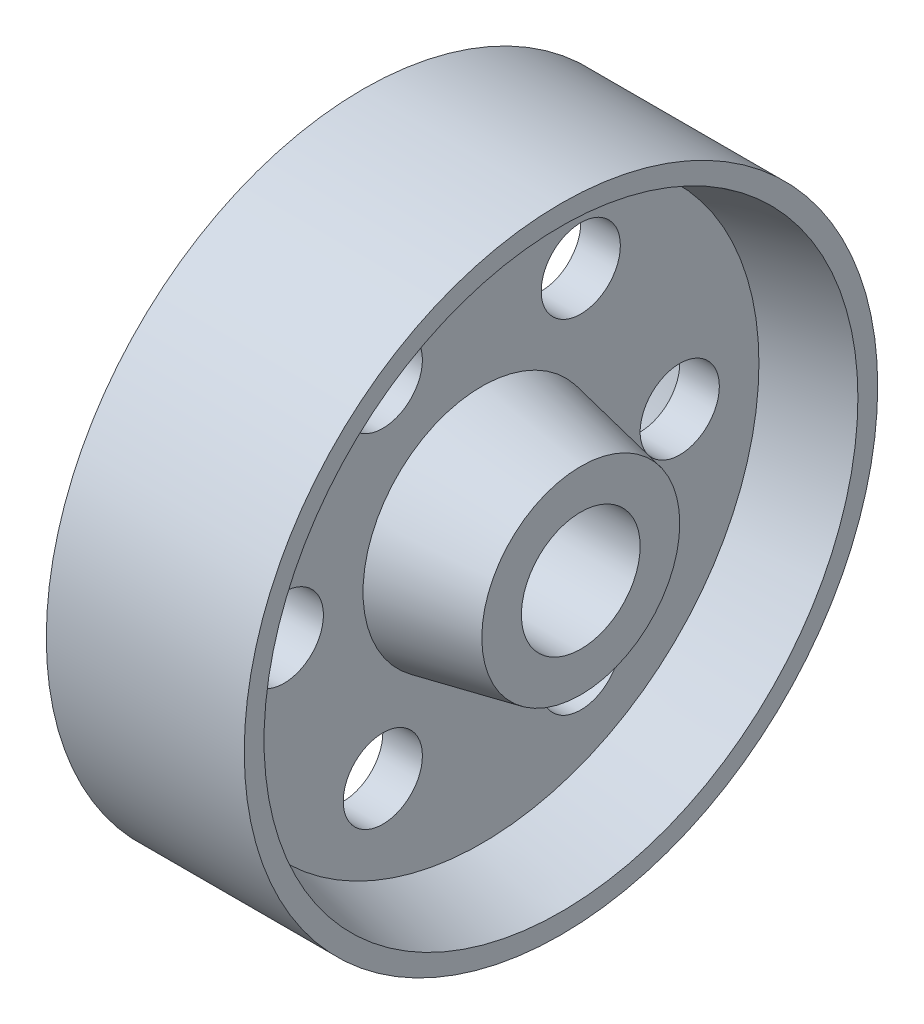
ISO-10303-21;
HEADER;
FILE_DESCRIPTION(('STEP AP214'),'2;1');
FILE_NAME('part.step','',(''),(''),'','','');
FILE_SCHEMA(('AUTOMOTIVE_DESIGN { 1 0 10303 214 1 1 1 1 }'));
ENDSEC;
DATA;
#1=APPLICATION_CONTEXT('core data for automotive mechanical design processes');
#2=APPLICATION_PROTOCOL_DEFINITION('international standard','automotive_design',2000,#1);
#3=PRODUCT_CONTEXT('',#1,'mechanical');
#4=PRODUCT('Part','Part','',(#3));
#5=PRODUCT_RELATED_PRODUCT_CATEGORY('part','',(#4));
#6=PRODUCT_DEFINITION_FORMATION('','',#4);
#7=PRODUCT_DEFINITION_CONTEXT('part definition',#1,'design');
#8=PRODUCT_DEFINITION('design','',#6,#7);
#9=PRODUCT_DEFINITION_SHAPE('','',#8);
#10=(LENGTH_UNIT() NAMED_UNIT(*) SI_UNIT(.MILLI.,.METRE.));
#11=(NAMED_UNIT(*) PLANE_ANGLE_UNIT() SI_UNIT($,.RADIAN.));
#12=(NAMED_UNIT(*) SI_UNIT($,.STERADIAN.) SOLID_ANGLE_UNIT());
#13=UNCERTAINTY_MEASURE_WITH_UNIT(LENGTH_MEASURE(1.E-05),#10,'distance_accuracy_value','');
#14=(GEOMETRIC_REPRESENTATION_CONTEXT(3) GLOBAL_UNCERTAINTY_ASSIGNED_CONTEXT((#13)) GLOBAL_UNIT_ASSIGNED_CONTEXT((#10,
#11,#12)) REPRESENTATION_CONTEXT('',''));
#15=CARTESIAN_POINT('',(0.,0.,0.));
#16=DIRECTION('',(0.,0.,1.));
#17=DIRECTION('',(1.,0.,0.));
#18=AXIS2_PLACEMENT_3D('',#15,#16,#17);
#19=CARTESIAN_POINT('',(0.,0.,0.));
#20=DIRECTION('',(1.,0.,0.));
#21=DIRECTION('',(0.,0.,-1.));
#22=AXIS2_PLACEMENT_3D('',#19,#20,#21);
#23=CYLINDRICAL_SURFACE('',#22,50.8);
#24=CARTESIAN_POINT('',(-15.875,0.,0.));
#25=DIRECTION('',(1.,0.,0.));
#26=DIRECTION('',(0.,0.,-1.));
#27=AXIS2_PLACEMENT_3D('',#24,#25,#26);
#28=CIRCLE('',#27,50.8);
#29=CARTESIAN_POINT('',(-15.875,0.,-50.8));
#30=VERTEX_POINT('',#29);
#31=EDGE_CURVE('E84',#30,#30,#28,.T.);
#32=ORIENTED_EDGE('',*,*,#31,.T.);
#33=EDGE_LOOP('',(#32));
#34=FACE_BOUND('',#33,.T.);
#35=CARTESIAN_POINT('',(15.875,0.,0.));
#36=DIRECTION('',(1.,0.,0.));
#37=DIRECTION('',(0.,0.,-1.));
#38=AXIS2_PLACEMENT_3D('',#35,#36,#37);
#39=CIRCLE('',#38,50.8);
#40=CARTESIAN_POINT('',(15.875,0.,-50.8));
#41=VERTEX_POINT('',#40);
#42=EDGE_CURVE('E131',#41,#41,#39,.T.);
#43=ORIENTED_EDGE('',*,*,#42,.F.);
#44=EDGE_LOOP('',(#43));
#45=FACE_BOUND('',#44,.T.);
#46=ADVANCED_FACE('F43',(#34,#45),#23,.T.);
#47=CARTESIAN_POINT('',(0.,0.,0.));
#48=DIRECTION('',(1.,0.,0.));
#49=DIRECTION('',(0.,0.,-1.));
#50=AXIS2_PLACEMENT_3D('',#47,#48,#49);
#51=CYLINDRICAL_SURFACE('',#50,9.525);
#52=CARTESIAN_POINT('',(-19.05,0.,0.));
#53=DIRECTION('',(1.,0.,0.));
#54=DIRECTION('',(0.,0.,-1.));
#55=AXIS2_PLACEMENT_3D('',#52,#53,#54);
#56=CIRCLE('',#55,9.525);
#57=CARTESIAN_POINT('',(-19.05,0.,-9.525));
#58=VERTEX_POINT('',#57);
#59=EDGE_CURVE('E10',#58,#58,#56,.T.);
#60=ORIENTED_EDGE('',*,*,#59,.F.);
#61=EDGE_LOOP('',(#60));
#62=FACE_BOUND('',#61,.T.);
#63=CARTESIAN_POINT('',(19.05,0.,0.));
#64=DIRECTION('',(1.,0.,0.));
#65=DIRECTION('',(0.,0.,-1.));
#66=AXIS2_PLACEMENT_3D('',#63,#64,#65);
#67=CIRCLE('',#66,9.525);
#68=CARTESIAN_POINT('',(19.05,0.,-9.525));
#69=VERTEX_POINT('',#68);
#70=EDGE_CURVE('E66',#69,#69,#67,.T.);
#71=ORIENTED_EDGE('',*,*,#70,.T.);
#72=EDGE_LOOP('',(#71));
#73=FACE_BOUND('',#72,.T.);
#74=ADVANCED_FACE('F117',(#62,#73),#51,.F.);
#75=CARTESIAN_POINT('',(-19.05,0.,0.));
#76=DIRECTION('',(1.,0.,0.));
#77=DIRECTION('',(0.,0.,-1.));
#78=AXIS2_PLACEMENT_3D('',#75,#76,#77);
#79=PLANE('',#78);
#80=CARTESIAN_POINT('',(-19.05,0.,0.));
#81=DIRECTION('',(1.,0.,0.));
#82=DIRECTION('',(0.,0.,-1.));
#83=AXIS2_PLACEMENT_3D('',#80,#81,#82);
#84=CIRCLE('',#83,15.875);
#85=CARTESIAN_POINT('',(-19.05,0.,-15.875));
#86=VERTEX_POINT('',#85);
#87=EDGE_CURVE('E51',#86,#86,#84,.T.);
#88=ORIENTED_EDGE('',*,*,#87,.F.);
#89=EDGE_LOOP('',(#88));
#90=FACE_BOUND('',#89,.T.);
#91=ORIENTED_EDGE('',*,*,#59,.T.);
#92=EDGE_LOOP('',(#91));
#93=FACE_BOUND('',#92,.T.);
#94=ADVANCED_FACE('F112',(#90,#93),#79,.F.);
#95=CARTESIAN_POINT('',(-19.05,0.,0.));
#96=DIRECTION('',(1.,0.,0.));
#97=DIRECTION('',(0.,0.,-1.));
#98=AXIS2_PLACEMENT_3D('',#95,#96,#97);
#99=CONICAL_SURFACE('',#98,15.875,0.197395559849881);
#100=CARTESIAN_POINT('',(-3.175,0.,0.));
#101=DIRECTION('',(1.,0.,0.));
#102=DIRECTION('',(0.,0.,-1.));
#103=AXIS2_PLACEMENT_3D('',#100,#101,#102);
#104=CIRCLE('',#103,19.05);
#105=CARTESIAN_POINT('',(-3.175,0.,-19.05));
#106=VERTEX_POINT('',#105);
#107=EDGE_CURVE('E57',#106,#106,#104,.T.);
#108=ORIENTED_EDGE('',*,*,#107,.F.);
#109=EDGE_LOOP('',(#108));
#110=FACE_BOUND('',#109,.T.);
#111=ORIENTED_EDGE('',*,*,#87,.T.);
#112=EDGE_LOOP('',(#111));
#113=FACE_BOUND('',#112,.T.);
#114=ADVANCED_FACE('F109',(#110,#113),#99,.T.);
#115=CARTESIAN_POINT('',(-3.175,0.,0.));
#116=DIRECTION('',(1.,0.,0.));
#117=DIRECTION('',(0.,0.,-1.));
#118=AXIS2_PLACEMENT_3D('',#115,#116,#117);
#119=PLANE('',#118);
#120=CARTESIAN_POINT('',(-3.175,0.,31.75));
#121=DIRECTION('',(1.,0.,0.));
#122=DIRECTION('',(0.,0.,-1.));
#123=AXIS2_PLACEMENT_3D('',#120,#121,#122);
#124=CIRCLE('',#123,6.35);
#125=CARTESIAN_POINT('',(-3.175,0.,25.4));
#126=VERTEX_POINT('',#125);
#127=EDGE_CURVE('E46',#126,#126,#124,.T.);
#128=ORIENTED_EDGE('',*,*,#127,.T.);
#129=EDGE_LOOP('',(#128));
#130=FACE_BOUND('',#129,.T.);
#131=CARTESIAN_POINT('',(-3.175,-27.4963065701557,15.8750000000003));
#132=DIRECTION('',(1.,0.,0.));
#133=DIRECTION('',(0.,0.,-1.));
#134=AXIS2_PLACEMENT_3D('',#131,#132,#133);
#135=CIRCLE('',#134,6.35);
#136=CARTESIAN_POINT('',(-3.175,-27.4963065701557,9.52500000000032));
#137=VERTEX_POINT('',#136);
#138=EDGE_CURVE('E77',#137,#137,#135,.T.);
#139=ORIENTED_EDGE('',*,*,#138,.T.);
#140=EDGE_LOOP('',(#139));
#141=FACE_BOUND('',#140,.T.);
#142=CARTESIAN_POINT('',(-3.175,-27.4963065701561,-15.8749999999997));
#143=DIRECTION('',(1.,0.,0.));
#144=DIRECTION('',(0.,0.,-1.));
#145=AXIS2_PLACEMENT_3D('',#142,#143,#144);
#146=CIRCLE('',#145,6.35);
#147=CARTESIAN_POINT('',(-3.175,-27.4963065701561,-22.2249999999997));
#148=VERTEX_POINT('',#147);
#149=EDGE_CURVE('E74',#148,#148,#146,.T.);
#150=ORIENTED_EDGE('',*,*,#149,.T.);
#151=EDGE_LOOP('',(#150));
#152=FACE_BOUND('',#151,.T.);
#153=CARTESIAN_POINT('',(-3.175,-2.21709065016539E-13,-31.75));
#154=DIRECTION('',(1.,0.,0.));
#155=DIRECTION('',(0.,0.,-1.));
#156=AXIS2_PLACEMENT_3D('',#153,#154,#155);
#157=CIRCLE('',#156,6.35);
#158=CARTESIAN_POINT('',(-3.175,-2.21709065016539E-13,-38.1));
#159=VERTEX_POINT('',#158);
#160=EDGE_CURVE('E70',#159,#159,#157,.T.);
#161=ORIENTED_EDGE('',*,*,#160,.T.);
#162=EDGE_LOOP('',(#161));
#163=FACE_BOUND('',#162,.T.);
#164=CARTESIAN_POINT('',(-3.175,27.4963065701559,-15.8750000000001));
#165=DIRECTION('',(1.,0.,0.));
#166=DIRECTION('',(0.,0.,-1.));
#167=AXIS2_PLACEMENT_3D('',#164,#165,#166);
#168=CIRCLE('',#167,6.35);
#169=CARTESIAN_POINT('',(-3.175,27.4963065701559,-22.2250000000001));
#170=VERTEX_POINT('',#169);
#171=EDGE_CURVE('E65',#170,#170,#168,.T.);
#172=ORIENTED_EDGE('',*,*,#171,.T.);
#173=EDGE_LOOP('',(#172));
#174=FACE_BOUND('',#173,.T.);
#175=CARTESIAN_POINT('',(-3.175,27.496306570156,15.8749999999999));
#176=DIRECTION('',(1.,0.,0.));
#177=DIRECTION('',(0.,0.,-1.));
#178=AXIS2_PLACEMENT_3D('',#175,#176,#177);
#179=CIRCLE('',#178,6.35);
#180=CARTESIAN_POINT('',(-3.175,27.496306570156,9.52499999999994));
#181=VERTEX_POINT('',#180);
#182=EDGE_CURVE('E61',#181,#181,#179,.T.);
#183=ORIENTED_EDGE('',*,*,#182,.T.);
#184=EDGE_LOOP('',(#183));
#185=FACE_BOUND('',#184,.T.);
#186=CARTESIAN_POINT('',(-3.175,0.,0.));
#187=DIRECTION('',(1.,0.,0.));
#188=DIRECTION('',(0.,0.,-1.));
#189=AXIS2_PLACEMENT_3D('',#186,#187,#188);
#190=CIRCLE('',#189,44.45);
#191=CARTESIAN_POINT('',(-3.175,0.,-44.45));
#192=VERTEX_POINT('',#191);
#193=EDGE_CURVE('E95',#192,#192,#190,.T.);
#194=ORIENTED_EDGE('',*,*,#193,.F.);
#195=EDGE_LOOP('',(#194));
#196=FACE_BOUND('',#195,.T.);
#197=ORIENTED_EDGE('',*,*,#107,.T.);
#198=EDGE_LOOP('',(#197));
#199=FACE_BOUND('',#198,.T.);
#200=ADVANCED_FACE('F107',(#130,#141,#152,#163,#174,#185,#196,#199),#119,.F.);
#201=CARTESIAN_POINT('',(-3.175,0.,0.));
#202=DIRECTION('',(-1.,0.,0.));
#203=DIRECTION('',(0.,0.,1.));
#204=AXIS2_PLACEMENT_3D('',#201,#202,#203);
#205=CONICAL_SURFACE('',#204,44.45,0.244978663126864);
#206=CARTESIAN_POINT('',(-15.875,0.,0.));
#207=DIRECTION('',(1.,0.,0.));
#208=DIRECTION('',(0.,0.,-1.));
#209=AXIS2_PLACEMENT_3D('',#206,#207,#208);
#210=CIRCLE('',#209,47.625);
#211=CARTESIAN_POINT('',(-15.875,0.,-47.625));
#212=VERTEX_POINT('',#211);
#213=EDGE_CURVE('E89',#212,#212,#210,.T.);
#214=ORIENTED_EDGE('',*,*,#213,.F.);
#215=EDGE_LOOP('',(#214));
#216=FACE_BOUND('',#215,.T.);
#217=ORIENTED_EDGE('',*,*,#193,.T.);
#218=EDGE_LOOP('',(#217));
#219=FACE_BOUND('',#218,.T.);
#220=ADVANCED_FACE('F238',(#216,#219),#205,.F.);
#221=CARTESIAN_POINT('',(-15.875,0.,0.));
#222=DIRECTION('',(1.,0.,0.));
#223=DIRECTION('',(0.,0.,-1.));
#224=AXIS2_PLACEMENT_3D('',#221,#222,#223);
#225=PLANE('',#224);
#226=ORIENTED_EDGE('',*,*,#31,.F.);
#227=EDGE_LOOP('',(#226));
#228=FACE_BOUND('',#227,.T.);
#229=ORIENTED_EDGE('',*,*,#213,.T.);
#230=EDGE_LOOP('',(#229));
#231=FACE_BOUND('',#230,.T.);
#232=ADVANCED_FACE('F224',(#228,#231),#225,.F.);
#233=CARTESIAN_POINT('',(-19.05,27.496306570156,15.8749999999999));
#234=DIRECTION('',(1.,0.,0.));
#235=DIRECTION('',(0.,0.,-1.));
#236=AXIS2_PLACEMENT_3D('',#233,#234,#235);
#237=CYLINDRICAL_SURFACE('',#236,6.35);
#238=ORIENTED_EDGE('',*,*,#182,.F.);
#239=EDGE_LOOP('',(#238));
#240=FACE_BOUND('',#239,.T.);
#241=CARTESIAN_POINT('',(3.175,27.496306570156,15.8749999999999));
#242=DIRECTION('',(1.,0.,0.));
#243=DIRECTION('',(0.,0.,-1.));
#244=AXIS2_PLACEMENT_3D('',#241,#242,#243);
#245=CIRCLE('',#244,6.35);
#246=CARTESIAN_POINT('',(3.175,27.496306570156,9.52499999999994));
#247=VERTEX_POINT('',#246);
#248=EDGE_CURVE('E158',#247,#247,#245,.T.);
#249=ORIENTED_EDGE('',*,*,#248,.T.);
#250=EDGE_LOOP('',(#249));
#251=FACE_BOUND('',#250,.T.);
#252=ADVANCED_FACE('F220',(#240,#251),#237,.F.);
#253=CARTESIAN_POINT('',(-19.05,27.4963065701559,-15.8750000000001));
#254=DIRECTION('',(1.,0.,0.));
#255=DIRECTION('',(0.,0.,-1.));
#256=AXIS2_PLACEMENT_3D('',#253,#254,#255);
#257=CYLINDRICAL_SURFACE('',#256,6.35);
#258=ORIENTED_EDGE('',*,*,#171,.F.);
#259=EDGE_LOOP('',(#258));
#260=FACE_BOUND('',#259,.T.);
#261=CARTESIAN_POINT('',(3.175,27.4963065701559,-15.8750000000001));
#262=DIRECTION('',(1.,0.,0.));
#263=DIRECTION('',(0.,0.,-1.));
#264=AXIS2_PLACEMENT_3D('',#261,#262,#263);
#265=CIRCLE('',#264,6.35);
#266=CARTESIAN_POINT('',(3.175,27.4963065701559,-22.2250000000001));
#267=VERTEX_POINT('',#266);
#268=EDGE_CURVE('E162',#267,#267,#265,.T.);
#269=ORIENTED_EDGE('',*,*,#268,.T.);
#270=EDGE_LOOP('',(#269));
#271=FACE_BOUND('',#270,.T.);
#272=ADVANCED_FACE('F223',(#260,#271),#257,.F.);
#273=CARTESIAN_POINT('',(-19.05,-2.21709065016539E-13,-31.75));
#274=DIRECTION('',(1.,0.,0.));
#275=DIRECTION('',(0.,0.,-1.));
#276=AXIS2_PLACEMENT_3D('',#273,#274,#275);
#277=CYLINDRICAL_SURFACE('',#276,6.35);
#278=ORIENTED_EDGE('',*,*,#160,.F.);
#279=EDGE_LOOP('',(#278));
#280=FACE_BOUND('',#279,.T.);
#281=CARTESIAN_POINT('',(3.175,-2.21709065016539E-13,-31.75));
#282=DIRECTION('',(1.,0.,0.));
#283=DIRECTION('',(0.,0.,-1.));
#284=AXIS2_PLACEMENT_3D('',#281,#282,#283);
#285=CIRCLE('',#284,6.35);
#286=CARTESIAN_POINT('',(3.175,-2.21709065016539E-13,-38.1));
#287=VERTEX_POINT('',#286);
#288=EDGE_CURVE('E166',#287,#287,#285,.T.);
#289=ORIENTED_EDGE('',*,*,#288,.T.);
#290=EDGE_LOOP('',(#289));
#291=FACE_BOUND('',#290,.T.);
#292=ADVANCED_FACE('F228',(#280,#291),#277,.F.);
#293=CARTESIAN_POINT('',(-19.05,-27.4963065701561,-15.8749999999997));
#294=DIRECTION('',(1.,0.,0.));
#295=DIRECTION('',(0.,0.,-1.));
#296=AXIS2_PLACEMENT_3D('',#293,#294,#295);
#297=CYLINDRICAL_SURFACE('',#296,6.35);
#298=ORIENTED_EDGE('',*,*,#149,.F.);
#299=EDGE_LOOP('',(#298));
#300=FACE_BOUND('',#299,.T.);
#301=CARTESIAN_POINT('',(3.175,-27.4963065701561,-15.8749999999997));
#302=DIRECTION('',(1.,0.,0.));
#303=DIRECTION('',(0.,0.,-1.));
#304=AXIS2_PLACEMENT_3D('',#301,#302,#303);
#305=CIRCLE('',#304,6.35);
#306=CARTESIAN_POINT('',(3.175,-27.4963065701561,-22.2249999999997));
#307=VERTEX_POINT('',#306);
#308=EDGE_CURVE('E170',#307,#307,#305,.T.);
#309=ORIENTED_EDGE('',*,*,#308,.T.);
#310=EDGE_LOOP('',(#309));
#311=FACE_BOUND('',#310,.T.);
#312=ADVANCED_FACE('F218',(#300,#311),#297,.F.);
#313=CARTESIAN_POINT('',(-19.05,-27.4963065701557,15.8750000000003));
#314=DIRECTION('',(1.,0.,0.));
#315=DIRECTION('',(0.,0.,-1.));
#316=AXIS2_PLACEMENT_3D('',#313,#314,#315);
#317=CYLINDRICAL_SURFACE('',#316,6.35);
#318=ORIENTED_EDGE('',*,*,#138,.F.);
#319=EDGE_LOOP('',(#318));
#320=FACE_BOUND('',#319,.T.);
#321=CARTESIAN_POINT('',(3.175,-27.4963065701557,15.8750000000003));
#322=DIRECTION('',(1.,0.,0.));
#323=DIRECTION('',(0.,0.,-1.));
#324=AXIS2_PLACEMENT_3D('',#321,#322,#323);
#325=CIRCLE('',#324,6.35);
#326=CARTESIAN_POINT('',(3.175,-27.4963065701557,9.52500000000032));
#327=VERTEX_POINT('',#326);
#328=EDGE_CURVE('E142',#327,#327,#325,.T.);
#329=ORIENTED_EDGE('',*,*,#328,.T.);
#330=EDGE_LOOP('',(#329));
#331=FACE_BOUND('',#330,.T.);
#332=ADVANCED_FACE('F177',(#320,#331),#317,.F.);
#333=CARTESIAN_POINT('',(-19.05,0.,31.75));
#334=DIRECTION('',(1.,0.,0.));
#335=DIRECTION('',(0.,0.,-1.));
#336=AXIS2_PLACEMENT_3D('',#333,#334,#335);
#337=CYLINDRICAL_SURFACE('',#336,6.35);
#338=ORIENTED_EDGE('',*,*,#127,.F.);
#339=EDGE_LOOP('',(#338));
#340=FACE_BOUND('',#339,.T.);
#341=CARTESIAN_POINT('',(3.175,0.,31.75));
#342=DIRECTION('',(1.,0.,0.));
#343=DIRECTION('',(0.,0.,-1.));
#344=AXIS2_PLACEMENT_3D('',#341,#342,#343);
#345=CIRCLE('',#344,6.35);
#346=CARTESIAN_POINT('',(3.175,0.,25.4));
#347=VERTEX_POINT('',#346);
#348=EDGE_CURVE('E98',#347,#347,#345,.T.);
#349=ORIENTED_EDGE('',*,*,#348,.T.);
#350=EDGE_LOOP('',(#349));
#351=FACE_BOUND('',#350,.T.);
#352=ADVANCED_FACE('F206',(#340,#351),#337,.F.);
#353=CARTESIAN_POINT('',(19.05,0.,0.));
#354=DIRECTION('',(-1.,0.,0.));
#355=DIRECTION('',(0.,0.,-1.));
#356=AXIS2_PLACEMENT_3D('',#353,#354,#355);
#357=PLANE('',#356);
#358=CARTESIAN_POINT('',(19.05,0.,0.));
#359=DIRECTION('',(1.,0.,0.));
#360=DIRECTION('',(0.,0.,-1.));
#361=AXIS2_PLACEMENT_3D('',#358,#359,#360);
#362=CIRCLE('',#361,15.875);
#363=CARTESIAN_POINT('',(19.05,0.,-15.875));
#364=VERTEX_POINT('',#363);
#365=EDGE_CURVE('E151',#364,#364,#362,.T.);
#366=ORIENTED_EDGE('',*,*,#365,.T.);
#367=EDGE_LOOP('',(#366));
#368=FACE_BOUND('',#367,.T.);
#369=ORIENTED_EDGE('',*,*,#70,.F.);
#370=EDGE_LOOP('',(#369));
#371=FACE_BOUND('',#370,.T.);
#372=ADVANCED_FACE('F200',(#368,#371),#357,.F.);
#373=CARTESIAN_POINT('',(19.05,0.,0.));
#374=DIRECTION('',(-1.,0.,0.));
#375=DIRECTION('',(0.,0.,-1.));
#376=AXIS2_PLACEMENT_3D('',#373,#374,#375);
#377=CONICAL_SURFACE('',#376,15.875,0.197395559849881);
#378=CARTESIAN_POINT('',(3.175,0.,0.));
#379=DIRECTION('',(1.,0.,0.));
#380=DIRECTION('',(0.,0.,-1.));
#381=AXIS2_PLACEMENT_3D('',#378,#379,#380);
#382=CIRCLE('',#381,19.05);
#383=CARTESIAN_POINT('',(3.175,0.,-19.05));
#384=VERTEX_POINT('',#383);
#385=EDGE_CURVE('E147',#384,#384,#382,.T.);
#386=ORIENTED_EDGE('',*,*,#385,.T.);
#387=EDGE_LOOP('',(#386));
#388=FACE_BOUND('',#387,.T.);
#389=ORIENTED_EDGE('',*,*,#365,.F.);
#390=EDGE_LOOP('',(#389));
#391=FACE_BOUND('',#390,.T.);
#392=ADVANCED_FACE('F183',(#388,#391),#377,.T.);
#393=CARTESIAN_POINT('',(3.175,0.,0.));
#394=DIRECTION('',(-1.,0.,0.));
#395=DIRECTION('',(0.,0.,-1.));
#396=AXIS2_PLACEMENT_3D('',#393,#394,#395);
#397=PLANE('',#396);
#398=ORIENTED_EDGE('',*,*,#348,.F.);
#399=EDGE_LOOP('',(#398));
#400=FACE_BOUND('',#399,.T.);
#401=ORIENTED_EDGE('',*,*,#328,.F.);
#402=EDGE_LOOP('',(#401));
#403=FACE_BOUND('',#402,.T.);
#404=ORIENTED_EDGE('',*,*,#308,.F.);
#405=EDGE_LOOP('',(#404));
#406=FACE_BOUND('',#405,.T.);
#407=ORIENTED_EDGE('',*,*,#288,.F.);
#408=EDGE_LOOP('',(#407));
#409=FACE_BOUND('',#408,.T.);
#410=ORIENTED_EDGE('',*,*,#268,.F.);
#411=EDGE_LOOP('',(#410));
#412=FACE_BOUND('',#411,.T.);
#413=ORIENTED_EDGE('',*,*,#248,.F.);
#414=EDGE_LOOP('',(#413));
#415=FACE_BOUND('',#414,.T.);
#416=CARTESIAN_POINT('',(3.175,0.,0.));
#417=DIRECTION('',(1.,0.,0.));
#418=DIRECTION('',(0.,0.,-1.));
#419=AXIS2_PLACEMENT_3D('',#416,#417,#418);
#420=CIRCLE('',#419,44.45);
#421=CARTESIAN_POINT('',(3.175,0.,-44.45));
#422=VERTEX_POINT('',#421);
#423=EDGE_CURVE('E139',#422,#422,#420,.T.);
#424=ORIENTED_EDGE('',*,*,#423,.T.);
#425=EDGE_LOOP('',(#424));
#426=FACE_BOUND('',#425,.T.);
#427=ORIENTED_EDGE('',*,*,#385,.F.);
#428=EDGE_LOOP('',(#427));
#429=FACE_BOUND('',#428,.T.);
#430=ADVANCED_FACE('F179',(#400,#403,#406,#409,#412,#415,#426,#429),#397,.F.);
#431=CARTESIAN_POINT('',(3.175,0.,0.));
#432=DIRECTION('',(1.,0.,0.));
#433=DIRECTION('',(0.,0.,1.));
#434=AXIS2_PLACEMENT_3D('',#431,#432,#433);
#435=CONICAL_SURFACE('',#434,44.45,0.244978663126864);
#436=CARTESIAN_POINT('',(15.875,0.,0.));
#437=DIRECTION('',(1.,0.,0.));
#438=DIRECTION('',(0.,0.,-1.));
#439=AXIS2_PLACEMENT_3D('',#436,#437,#438);
#440=CIRCLE('',#439,47.625);
#441=CARTESIAN_POINT('',(15.875,0.,-47.625));
#442=VERTEX_POINT('',#441);
#443=EDGE_CURVE('E134',#442,#442,#440,.T.);
#444=ORIENTED_EDGE('',*,*,#443,.T.);
#445=EDGE_LOOP('',(#444));
#446=FACE_BOUND('',#445,.T.);
#447=ORIENTED_EDGE('',*,*,#423,.F.);
#448=EDGE_LOOP('',(#447));
#449=FACE_BOUND('',#448,.T.);
#450=ADVANCED_FACE('F182',(#446,#449),#435,.F.);
#451=CARTESIAN_POINT('',(15.875,0.,0.));
#452=DIRECTION('',(-1.,0.,0.));
#453=DIRECTION('',(0.,0.,-1.));
#454=AXIS2_PLACEMENT_3D('',#451,#452,#453);
#455=PLANE('',#454);
#456=ORIENTED_EDGE('',*,*,#42,.T.);
#457=EDGE_LOOP('',(#456));
#458=FACE_BOUND('',#457,.T.);
#459=ORIENTED_EDGE('',*,*,#443,.F.);
#460=EDGE_LOOP('',(#459));
#461=FACE_BOUND('',#460,.T.);
#462=ADVANCED_FACE('F343',(#458,#461),#455,.F.);
#463=CLOSED_SHELL('',(#46,#74,#94,#114,#200,#220,#232,#252,#272,#292,#312,#332,#352,#372,#392,
#430,#450,#462));
#464=MANIFOLD_SOLID_BREP('B2',#463);
#465=ADVANCED_BREP_SHAPE_REPRESENTATION('',(#18,#464),#14);
#466=SHAPE_DEFINITION_REPRESENTATION(#9,#465);
ENDSEC;
END-ISO-10303-21;
